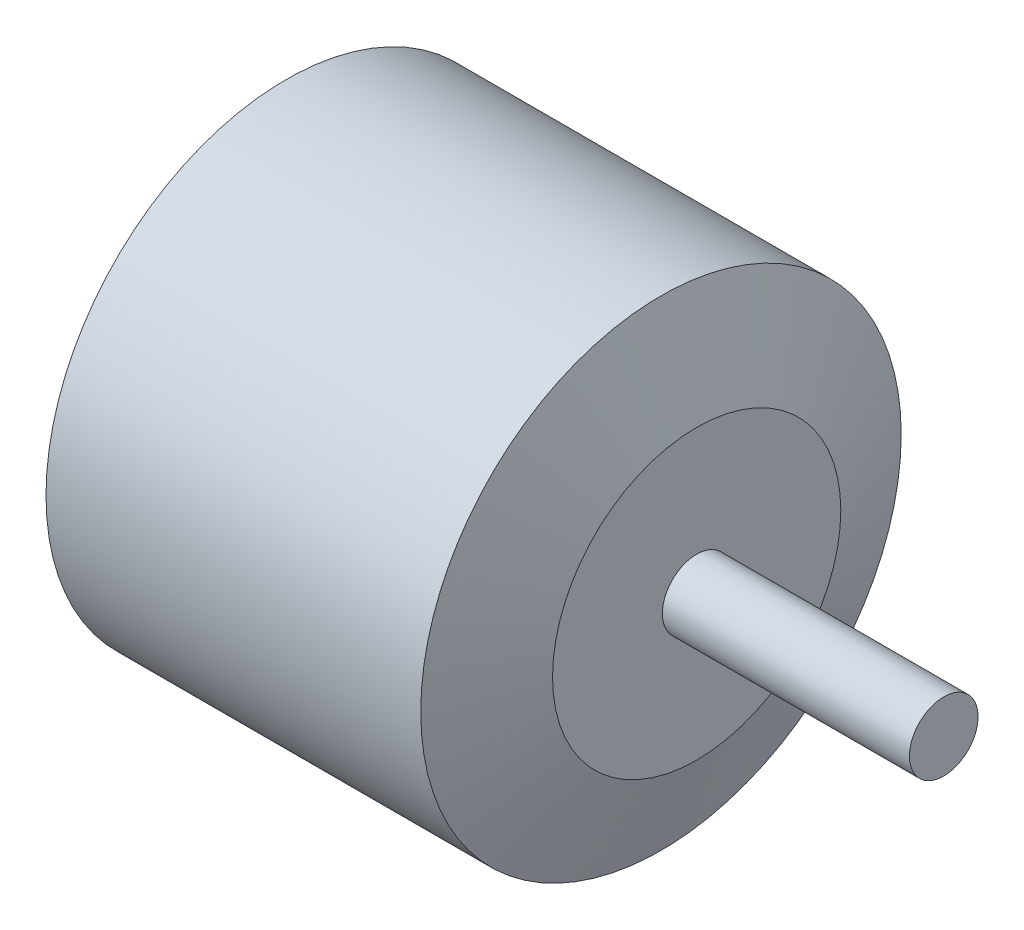
ISO-10303-21;
HEADER;
FILE_DESCRIPTION(('STEP AP214'),'2;1');
FILE_NAME('part.step','',(''),(''),'','','');
FILE_SCHEMA(('AUTOMOTIVE_DESIGN { 1 0 10303 214 1 1 1 1 }'));
ENDSEC;
DATA;
#1=APPLICATION_CONTEXT('core data for automotive mechanical design processes');
#2=APPLICATION_PROTOCOL_DEFINITION('international standard','automotive_design',2000,#1);
#3=PRODUCT_CONTEXT('',#1,'mechanical');
#4=PRODUCT('Part','Part','',(#3));
#5=PRODUCT_RELATED_PRODUCT_CATEGORY('part','',(#4));
#6=PRODUCT_DEFINITION_FORMATION('','',#4);
#7=PRODUCT_DEFINITION_CONTEXT('part definition',#1,'design');
#8=PRODUCT_DEFINITION('design','',#6,#7);
#9=PRODUCT_DEFINITION_SHAPE('','',#8);
#10=(LENGTH_UNIT() NAMED_UNIT(*) SI_UNIT(.MILLI.,.METRE.));
#11=(NAMED_UNIT(*) PLANE_ANGLE_UNIT() SI_UNIT($,.RADIAN.));
#12=(NAMED_UNIT(*) SI_UNIT($,.STERADIAN.) SOLID_ANGLE_UNIT());
#13=UNCERTAINTY_MEASURE_WITH_UNIT(LENGTH_MEASURE(1.E-05),#10,'distance_accuracy_value','');
#14=(GEOMETRIC_REPRESENTATION_CONTEXT(3) GLOBAL_UNCERTAINTY_ASSIGNED_CONTEXT((#13)) GLOBAL_UNIT_ASSIGNED_CONTEXT((#10,
#11,#12)) REPRESENTATION_CONTEXT('',''));
#15=CARTESIAN_POINT('',(0.,0.,0.));
#16=DIRECTION('',(0.,0.,1.));
#17=DIRECTION('',(1.,0.,0.));
#18=AXIS2_PLACEMENT_3D('',#15,#16,#17);
#19=CARTESIAN_POINT('',(0.,0.,0.));
#20=DIRECTION('',(-1.,0.,0.));
#21=DIRECTION('',(0.,0.,1.));
#22=AXIS2_PLACEMENT_3D('',#19,#20,#21);
#23=PLANE('',#22);
#24=CARTESIAN_POINT('',(0.,0.,0.));
#25=DIRECTION('',(-1.,0.,0.));
#26=DIRECTION('',(0.,0.,1.));
#27=AXIS2_PLACEMENT_3D('',#24,#25,#26);
#28=CIRCLE('',#27,2.5);
#29=CARTESIAN_POINT('',(0.,0.,2.5));
#30=VERTEX_POINT('',#29);
#31=EDGE_CURVE('E12',#30,#30,#28,.T.);
#32=ORIENTED_EDGE('',*,*,#31,.F.);
#33=EDGE_LOOP('',(#32));
#34=FACE_BOUND('',#33,.T.);
#35=ADVANCED_FACE('F43',(#34),#23,.F.);
#36=CARTESIAN_POINT('',(-53.,0.,0.));
#37=DIRECTION('',(-1.,0.,0.));
#38=DIRECTION('',(0.,0.,1.));
#39=AXIS2_PLACEMENT_3D('',#36,#37,#38);
#40=CYLINDRICAL_SURFACE('',#39,2.5);
#41=CARTESIAN_POINT('',(-18.,0.,0.));
#42=DIRECTION('',(-1.,0.,0.));
#43=DIRECTION('',(0.,0.,1.));
#44=AXIS2_PLACEMENT_3D('',#41,#42,#43);
#45=CIRCLE('',#44,2.5);
#46=CARTESIAN_POINT('',(-18.,0.,2.5));
#47=VERTEX_POINT('',#46);
#48=EDGE_CURVE('E49',#47,#47,#45,.T.);
#49=ORIENTED_EDGE('',*,*,#48,.F.);
#50=EDGE_LOOP('',(#49));
#51=FACE_BOUND('',#50,.T.);
#52=ORIENTED_EDGE('',*,*,#31,.T.);
#53=EDGE_LOOP('',(#52));
#54=FACE_BOUND('',#53,.T.);
#55=ADVANCED_FACE('F109',(#51,#54),#40,.T.);
#56=CARTESIAN_POINT('',(-18.,2.5,0.));
#57=DIRECTION('',(-1.,0.,0.));
#58=DIRECTION('',(0.,0.,1.));
#59=AXIS2_PLACEMENT_3D('',#56,#57,#58);
#60=PLANE('',#59);
#61=CARTESIAN_POINT('',(-18.,0.,0.));
#62=DIRECTION('',(-1.,0.,0.));
#63=DIRECTION('',(0.,0.,1.));
#64=AXIS2_PLACEMENT_3D('',#61,#62,#63);
#65=CIRCLE('',#64,10.5);
#66=CARTESIAN_POINT('',(-18.,0.,10.5));
#67=VERTEX_POINT('',#66);
#68=EDGE_CURVE('E53',#67,#67,#65,.T.);
#69=ORIENTED_EDGE('',*,*,#68,.F.);
#70=EDGE_LOOP('',(#69));
#71=FACE_BOUND('',#70,.T.);
#72=ORIENTED_EDGE('',*,*,#48,.T.);
#73=EDGE_LOOP('',(#72));
#74=FACE_BOUND('',#73,.T.);
#75=ADVANCED_FACE('F104',(#71,#74),#60,.F.);
#76=CARTESIAN_POINT('',(-18.,0.,0.));
#77=DIRECTION('',(-1.,0.,0.));
#78=DIRECTION('',(0.,0.,1.));
#79=AXIS2_PLACEMENT_3D('',#76,#77,#78);
#80=CONICAL_SURFACE('',#79,10.5,1.21516044249414);
#81=CARTESIAN_POINT('',(-20.6,0.,0.));
#82=DIRECTION('',(-1.,0.,0.));
#83=DIRECTION('',(0.,0.,1.));
#84=AXIS2_PLACEMENT_3D('',#81,#82,#83);
#85=CIRCLE('',#84,17.5);
#86=CARTESIAN_POINT('',(-20.6,0.,17.5));
#87=VERTEX_POINT('',#86);
#88=EDGE_CURVE('E57',#87,#87,#85,.T.);
#89=ORIENTED_EDGE('',*,*,#88,.F.);
#90=EDGE_LOOP('',(#89));
#91=FACE_BOUND('',#90,.T.);
#92=ORIENTED_EDGE('',*,*,#68,.T.);
#93=EDGE_LOOP('',(#92));
#94=FACE_BOUND('',#93,.T.);
#95=ADVANCED_FACE('F98',(#91,#94),#80,.T.);
#96=CARTESIAN_POINT('',(-53.,0.,0.));
#97=DIRECTION('',(-1.,0.,0.));
#98=DIRECTION('',(0.,0.,1.));
#99=AXIS2_PLACEMENT_3D('',#96,#97,#98);
#100=CYLINDRICAL_SURFACE('',#99,17.5);
#101=CARTESIAN_POINT('',(-47.9,0.,0.));
#102=DIRECTION('',(-1.,0.,0.));
#103=DIRECTION('',(0.,0.,1.));
#104=AXIS2_PLACEMENT_3D('',#101,#102,#103);
#105=CIRCLE('',#104,17.5);
#106=CARTESIAN_POINT('',(-47.9,0.,17.5));
#107=VERTEX_POINT('',#106);
#108=EDGE_CURVE('E62',#107,#107,#105,.T.);
#109=ORIENTED_EDGE('',*,*,#108,.F.);
#110=EDGE_LOOP('',(#109));
#111=FACE_BOUND('',#110,.T.);
#112=ORIENTED_EDGE('',*,*,#88,.T.);
#113=EDGE_LOOP('',(#112));
#114=FACE_BOUND('',#113,.T.);
#115=ADVANCED_FACE('F92',(#111,#114),#100,.T.);
#116=CARTESIAN_POINT('',(-47.9,0.,0.));
#117=DIRECTION('',(1.,0.,0.));
#118=DIRECTION('',(0.,0.,-1.));
#119=AXIS2_PLACEMENT_3D('',#116,#117,#118);
#120=CONICAL_SURFACE('',#119,17.5,1.21516044249414);
#121=CARTESIAN_POINT('',(-50.5,0.,0.));
#122=DIRECTION('',(-1.,0.,0.));
#123=DIRECTION('',(0.,0.,1.));
#124=AXIS2_PLACEMENT_3D('',#121,#122,#123);
#125=CIRCLE('',#124,10.5);
#126=CARTESIAN_POINT('',(-50.5,0.,10.5));
#127=VERTEX_POINT('',#126);
#128=EDGE_CURVE('E65',#127,#127,#125,.T.);
#129=ORIENTED_EDGE('',*,*,#128,.F.);
#130=EDGE_LOOP('',(#129));
#131=FACE_BOUND('',#130,.T.);
#132=ORIENTED_EDGE('',*,*,#108,.T.);
#133=EDGE_LOOP('',(#132));
#134=FACE_BOUND('',#133,.T.);
#135=ADVANCED_FACE('F86',(#131,#134),#120,.T.);
#136=CARTESIAN_POINT('',(-50.5,10.5,0.));
#137=DIRECTION('',(1.,0.,0.));
#138=DIRECTION('',(0.,0.,-1.));
#139=AXIS2_PLACEMENT_3D('',#136,#137,#138);
#140=PLANE('',#139);
#141=CARTESIAN_POINT('',(-50.5,0.,0.));
#142=DIRECTION('',(-1.,0.,0.));
#143=DIRECTION('',(0.,0.,1.));
#144=AXIS2_PLACEMENT_3D('',#141,#142,#143);
#145=CIRCLE('',#144,5.5);
#146=CARTESIAN_POINT('',(-50.5,0.,5.5));
#147=VERTEX_POINT('',#146);
#148=EDGE_CURVE('E68',#147,#147,#145,.T.);
#149=ORIENTED_EDGE('',*,*,#148,.F.);
#150=EDGE_LOOP('',(#149));
#151=FACE_BOUND('',#150,.T.);
#152=ORIENTED_EDGE('',*,*,#128,.T.);
#153=EDGE_LOOP('',(#152));
#154=FACE_BOUND('',#153,.T.);
#155=ADVANCED_FACE('F80',(#151,#154),#140,.F.);
#156=CARTESIAN_POINT('',(-53.,0.,0.));
#157=DIRECTION('',(-1.,0.,0.));
#158=DIRECTION('',(0.,0.,1.));
#159=AXIS2_PLACEMENT_3D('',#156,#157,#158);
#160=CYLINDRICAL_SURFACE('',#159,5.5);
#161=CARTESIAN_POINT('',(-53.,0.,0.));
#162=DIRECTION('',(-1.,0.,0.));
#163=DIRECTION('',(0.,0.,1.));
#164=AXIS2_PLACEMENT_3D('',#161,#162,#163);
#165=CIRCLE('',#164,5.5);
#166=CARTESIAN_POINT('',(-53.,0.,5.5));
#167=VERTEX_POINT('',#166);
#168=EDGE_CURVE('E71',#167,#167,#165,.T.);
#169=ORIENTED_EDGE('',*,*,#168,.F.);
#170=EDGE_LOOP('',(#169));
#171=FACE_BOUND('',#170,.T.);
#172=ORIENTED_EDGE('',*,*,#148,.T.);
#173=EDGE_LOOP('',(#172));
#174=FACE_BOUND('',#173,.T.);
#175=ADVANCED_FACE('F77',(#171,#174),#160,.T.);
#176=CARTESIAN_POINT('',(-53.,5.5,0.));
#177=DIRECTION('',(1.,0.,0.));
#178=DIRECTION('',(0.,0.,-1.));
#179=AXIS2_PLACEMENT_3D('',#176,#177,#178);
#180=PLANE('',#179);
#181=ORIENTED_EDGE('',*,*,#168,.T.);
#182=EDGE_LOOP('',(#181));
#183=FACE_BOUND('',#182,.T.);
#184=ADVANCED_FACE('F75',(#183),#180,.F.);
#185=CLOSED_SHELL('',(#35,#55,#75,#95,#115,#135,#155,#175,#184));
#186=MANIFOLD_SOLID_BREP('B2',#185);
#187=ADVANCED_BREP_SHAPE_REPRESENTATION('',(#18,#186),#14);
#188=SHAPE_DEFINITION_REPRESENTATION(#9,#187);
ENDSEC;
END-ISO-10303-21;
